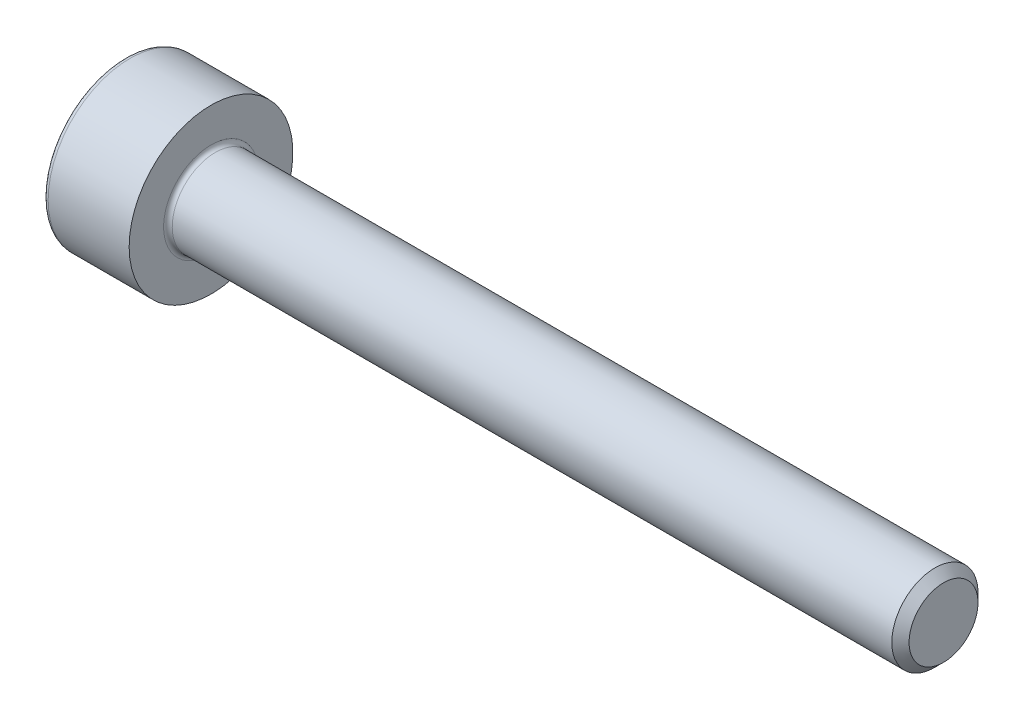
ISO-10303-21;
HEADER;
FILE_DESCRIPTION(('STEP AP214'),'2;1');
FILE_NAME('part.step','',(''),(''),'','','');
FILE_SCHEMA(('AUTOMOTIVE_DESIGN { 1 0 10303 214 1 1 1 1 }'));
ENDSEC;
DATA;
#1=APPLICATION_CONTEXT('core data for automotive mechanical design processes');
#2=APPLICATION_PROTOCOL_DEFINITION('international standard','automotive_design',2000,#1);
#3=PRODUCT_CONTEXT('',#1,'mechanical');
#4=PRODUCT('Part','Part','',(#3));
#5=PRODUCT_RELATED_PRODUCT_CATEGORY('part','',(#4));
#6=PRODUCT_DEFINITION_FORMATION('','',#4);
#7=PRODUCT_DEFINITION_CONTEXT('part definition',#1,'design');
#8=PRODUCT_DEFINITION('design','',#6,#7);
#9=PRODUCT_DEFINITION_SHAPE('','',#8);
#10=(LENGTH_UNIT() NAMED_UNIT(*) SI_UNIT(.MILLI.,.METRE.));
#11=(NAMED_UNIT(*) PLANE_ANGLE_UNIT() SI_UNIT($,.RADIAN.));
#12=(NAMED_UNIT(*) SI_UNIT($,.STERADIAN.) SOLID_ANGLE_UNIT());
#13=UNCERTAINTY_MEASURE_WITH_UNIT(LENGTH_MEASURE(1.E-05),#10,'distance_accuracy_value','');
#14=(GEOMETRIC_REPRESENTATION_CONTEXT(3) GLOBAL_UNCERTAINTY_ASSIGNED_CONTEXT((#13)) GLOBAL_UNIT_ASSIGNED_CONTEXT((#10,
#11,#12)) REPRESENTATION_CONTEXT('',''));
#15=CARTESIAN_POINT('',(0.,0.,0.));
#16=DIRECTION('',(0.,0.,1.));
#17=DIRECTION('',(1.,0.,0.));
#18=AXIS2_PLACEMENT_3D('',#15,#16,#17);
#19=CARTESIAN_POINT('',(19.0000000000048,0.,0.));
#20=DIRECTION('',(-1.,0.,0.));
#21=DIRECTION('',(0.,0.,1.));
#22=AXIS2_PLACEMENT_3D('',#19,#20,#21);
#23=PLANE('',#22);
#24=CARTESIAN_POINT('',(19.0000000000048,0.,0.));
#25=DIRECTION('',(-1.,0.,0.));
#26=DIRECTION('',(0.,0.,1.));
#27=AXIS2_PLACEMENT_3D('',#24,#25,#26);
#28=CIRCLE('',#27,0.800000000000004);
#29=CARTESIAN_POINT('',(19.0000000000048,0.,0.800000000000004));
#30=VERTEX_POINT('',#29);
#31=EDGE_CURVE('E11',#30,#30,#28,.F.);
#32=ORIENTED_EDGE('',*,*,#31,.T.);
#33=EDGE_LOOP('',(#32));
#34=FACE_BOUND('',#33,.T.);
#35=ADVANCED_FACE('F37',(#34),#23,.F.);
#36=CARTESIAN_POINT('',(0.,0.,0.));
#37=DIRECTION('',(-1.,0.,0.));
#38=DIRECTION('',(0.,0.,1.));
#39=AXIS2_PLACEMENT_3D('',#36,#37,#38);
#40=CYLINDRICAL_SURFACE('',#39,1.);
#41=CARTESIAN_POINT('',(18.8000000000048,0.,0.));
#42=DIRECTION('',(-1.,0.,0.));
#43=DIRECTION('',(0.,0.,1.));
#44=AXIS2_PLACEMENT_3D('',#41,#42,#43);
#45=CIRCLE('',#44,1.);
#46=CARTESIAN_POINT('',(18.8000000000048,0.,1.));
#47=VERTEX_POINT('',#46);
#48=EDGE_CURVE('E45',#47,#47,#45,.T.);
#49=ORIENTED_EDGE('',*,*,#48,.T.);
#50=EDGE_LOOP('',(#49));
#51=FACE_BOUND('',#50,.T.);
#52=CARTESIAN_POINT('',(2.10000000000477,0.,0.));
#53=DIRECTION('',(1.,0.,0.));
#54=DIRECTION('',(0.,0.,-1.));
#55=AXIS2_PLACEMENT_3D('',#52,#53,#54);
#56=CIRCLE('',#55,1.);
#57=CARTESIAN_POINT('',(2.10000000000477,0.,-1.));
#58=VERTEX_POINT('',#57);
#59=EDGE_CURVE('E150',#58,#58,#56,.T.);
#60=ORIENTED_EDGE('',*,*,#59,.T.);
#61=EDGE_LOOP('',(#60));
#62=FACE_BOUND('',#61,.T.);
#63=ADVANCED_FACE('F161',(#51,#62),#40,.T.);
#64=CARTESIAN_POINT('',(2.00000000000477,0.,0.));
#65=DIRECTION('',(1.,0.,0.));
#66=DIRECTION('',(0.,0.,-1.));
#67=AXIS2_PLACEMENT_3D('',#64,#65,#66);
#68=PLANE('',#67);
#69=CARTESIAN_POINT('',(2.00000000000477,0.,0.));
#70=DIRECTION('',(1.,0.,0.));
#71=DIRECTION('',(0.,0.,-1.));
#72=AXIS2_PLACEMENT_3D('',#69,#70,#71);
#73=CIRCLE('',#72,1.1);
#74=CARTESIAN_POINT('',(2.00000000000477,0.,-1.1));
#75=VERTEX_POINT('',#74);
#76=EDGE_CURVE('E147',#75,#75,#73,.F.);
#77=ORIENTED_EDGE('',*,*,#76,.T.);
#78=EDGE_LOOP('',(#77));
#79=FACE_BOUND('',#78,.T.);
#80=CARTESIAN_POINT('',(2.00000000000477,0.,0.));
#81=DIRECTION('',(-1.,0.,0.));
#82=DIRECTION('',(0.,0.,1.));
#83=AXIS2_PLACEMENT_3D('',#80,#81,#82);
#84=CIRCLE('',#83,1.9);
#85=CARTESIAN_POINT('',(2.00000000000477,0.,1.9));
#86=VERTEX_POINT('',#85);
#87=EDGE_CURVE('E139',#86,#86,#84,.T.);
#88=ORIENTED_EDGE('',*,*,#87,.F.);
#89=EDGE_LOOP('',(#88));
#90=FACE_BOUND('',#89,.T.);
#91=ADVANCED_FACE('F183',(#79,#90),#68,.T.);
#92=CARTESIAN_POINT('',(0.,0.,0.));
#93=DIRECTION('',(-1.,0.,0.));
#94=DIRECTION('',(0.,0.,1.));
#95=AXIS2_PLACEMENT_3D('',#92,#93,#94);
#96=CYLINDRICAL_SURFACE('',#95,1.9);
#97=CARTESIAN_POINT('',(0.12,0.,0.));
#98=DIRECTION('',(-1.,0.,0.));
#99=DIRECTION('',(0.,0.,1.));
#100=AXIS2_PLACEMENT_3D('',#97,#98,#99);
#101=CIRCLE('',#100,1.9);
#102=CARTESIAN_POINT('',(0.12,0.,1.9));
#103=VERTEX_POINT('',#102);
#104=EDGE_CURVE('E156',#103,#103,#101,.F.);
#105=ORIENTED_EDGE('',*,*,#104,.T.);
#106=EDGE_LOOP('',(#105));
#107=FACE_BOUND('',#106,.T.);
#108=ORIENTED_EDGE('',*,*,#87,.T.);
#109=EDGE_LOOP('',(#108));
#110=FACE_BOUND('',#109,.T.);
#111=ADVANCED_FACE('F193',(#107,#110),#96,.T.);
#112=CARTESIAN_POINT('',(0.,0.,0.));
#113=DIRECTION('',(-1.,0.,0.));
#114=DIRECTION('',(0.,0.,1.));
#115=AXIS2_PLACEMENT_3D('',#112,#113,#114);
#116=PLANE('',#115);
#117=DIRECTION('',(0.,0.5,-0.866025403784439));
#118=VECTOR('',#117,1.);
#119=CARTESIAN_POINT('',(0.,0.43301270189222,0.749999999999999));
#120=LINE('',#119,#118);
#121=CARTESIAN_POINT('',(0.,0.43301270189222,0.749999999999999));
#122=VERTEX_POINT('',#121);
#123=CARTESIAN_POINT('',(0.,0.866025403784438,0.));
#124=VERTEX_POINT('',#123);
#125=EDGE_CURVE('E52',#122,#124,#120,.T.);
#126=ORIENTED_EDGE('',*,*,#125,.F.);
#127=DIRECTION('',(0.,1.,0.));
#128=VECTOR('',#127,1.);
#129=CARTESIAN_POINT('',(0.,-0.43301270189222,0.749999999999999));
#130=LINE('',#129,#128);
#131=CARTESIAN_POINT('',(0.,-0.43301270189222,0.749999999999999));
#132=VERTEX_POINT('',#131);
#133=EDGE_CURVE('E135',#132,#122,#130,.T.);
#134=ORIENTED_EDGE('',*,*,#133,.F.);
#135=DIRECTION('',(0.,0.5,0.866025403784439));
#136=VECTOR('',#135,1.);
#137=CARTESIAN_POINT('',(0.,-0.866025403784438,0.));
#138=LINE('',#137,#136);
#139=CARTESIAN_POINT('',(0.,-0.866025403784438,0.));
#140=VERTEX_POINT('',#139);
#141=EDGE_CURVE('E133',#140,#132,#138,.T.);
#142=ORIENTED_EDGE('',*,*,#141,.F.);
#143=DIRECTION('',(0.,-0.5,0.866025403784439));
#144=VECTOR('',#143,1.);
#145=CARTESIAN_POINT('',(0.,-0.433012701892219,-0.75));
#146=LINE('',#145,#144);
#147=CARTESIAN_POINT('',(0.,-0.433012701892219,-0.75));
#148=VERTEX_POINT('',#147);
#149=EDGE_CURVE('E100',#148,#140,#146,.T.);
#150=ORIENTED_EDGE('',*,*,#149,.F.);
#151=DIRECTION('',(0.,-1.,0.));
#152=VECTOR('',#151,1.);
#153=CARTESIAN_POINT('',(0.,0.433012701892219,-0.75));
#154=LINE('',#153,#152);
#155=CARTESIAN_POINT('',(0.,0.433012701892219,-0.75));
#156=VERTEX_POINT('',#155);
#157=EDGE_CURVE('E129',#156,#148,#154,.T.);
#158=ORIENTED_EDGE('',*,*,#157,.F.);
#159=DIRECTION('',(0.,-0.5,-0.866025403784439));
#160=VECTOR('',#159,1.);
#161=CARTESIAN_POINT('',(0.,0.866025403784438,0.));
#162=LINE('',#161,#160);
#163=EDGE_CURVE('E126',#124,#156,#162,.T.);
#164=ORIENTED_EDGE('',*,*,#163,.F.);
#165=EDGE_LOOP('',(#126,#134,#142,#150,#158,#164));
#166=FACE_BOUND('',#165,.T.);
#167=CARTESIAN_POINT('',(0.,0.,0.));
#168=DIRECTION('',(-1.,0.,0.));
#169=DIRECTION('',(0.,0.,1.));
#170=AXIS2_PLACEMENT_3D('',#167,#168,#169);
#171=CIRCLE('',#170,1.78);
#172=CARTESIAN_POINT('',(0.,0.,1.78));
#173=VERTEX_POINT('',#172);
#174=EDGE_CURVE('E153',#173,#173,#171,.T.);
#175=ORIENTED_EDGE('',*,*,#174,.T.);
#176=EDGE_LOOP('',(#175));
#177=FACE_BOUND('',#176,.T.);
#178=ADVANCED_FACE('F188',(#166,#177),#116,.T.);
#179=CARTESIAN_POINT('',(2.10000000000477,0.,0.));
#180=DIRECTION('',(1.,0.,0.));
#181=DIRECTION('',(0.,0.,-1.));
#182=AXIS2_PLACEMENT_3D('',#179,#180,#181);
#183=TOROIDAL_SURFACE('',#182,1.1,0.1);
#184=ORIENTED_EDGE('',*,*,#59,.F.);
#185=EDGE_LOOP('',(#184));
#186=FACE_BOUND('',#185,.T.);
#187=ORIENTED_EDGE('',*,*,#76,.F.);
#188=EDGE_LOOP('',(#187));
#189=FACE_BOUND('',#188,.T.);
#190=ADVANCED_FACE('F174',(#186,#189),#183,.F.);
#191=CARTESIAN_POINT('',(0.12,0.,0.));
#192=DIRECTION('',(-1.,0.,0.));
#193=DIRECTION('',(0.,0.,1.));
#194=AXIS2_PLACEMENT_3D('',#191,#192,#193);
#195=TOROIDAL_SURFACE('',#194,1.78,0.12);
#196=ORIENTED_EDGE('',*,*,#104,.F.);
#197=EDGE_LOOP('',(#196));
#198=FACE_BOUND('',#197,.T.);
#199=ORIENTED_EDGE('',*,*,#174,.F.);
#200=EDGE_LOOP('',(#199));
#201=FACE_BOUND('',#200,.T.);
#202=ADVANCED_FACE('F166',(#198,#201),#195,.T.);
#203=CARTESIAN_POINT('',(18.8000000000048,0.,0.));
#204=DIRECTION('',(-1.,0.,0.));
#205=DIRECTION('',(0.,0.,1.));
#206=AXIS2_PLACEMENT_3D('',#203,#204,#205);
#207=CONICAL_SURFACE('',#206,1.,0.785398163397454);
#208=ORIENTED_EDGE('',*,*,#31,.F.);
#209=EDGE_LOOP('',(#208));
#210=FACE_BOUND('',#209,.T.);
#211=ORIENTED_EDGE('',*,*,#48,.F.);
#212=EDGE_LOOP('',(#211));
#213=FACE_BOUND('',#212,.T.);
#214=ADVANCED_FACE('F39',(#210,#213),#207,.T.);
#215=CARTESIAN_POINT('',(1.,0.43301270189222,0.749999999999999));
#216=DIRECTION('',(0.,0.866025403784439,0.5));
#217=DIRECTION('',(0.,-0.5,0.866025403784439));
#218=AXIS2_PLACEMENT_3D('',#215,#216,#217);
#219=PLANE('',#218);
#220=ORIENTED_EDGE('',*,*,#125,.T.);
#221=DIRECTION('',(-1.,0.,0.));
#222=VECTOR('',#221,1.);
#223=CARTESIAN_POINT('',(1.,0.866025403784438,0.));
#224=LINE('',#223,#222);
#225=CARTESIAN_POINT('',(1.,0.866025403784438,0.));
#226=VERTEX_POINT('',#225);
#227=EDGE_CURVE('E82',#226,#124,#224,.T.);
#228=ORIENTED_EDGE('',*,*,#227,.F.);
#229=DIRECTION('',(0.,0.5,-0.866025403784439));
#230=VECTOR('',#229,1.);
#231=CARTESIAN_POINT('',(1.,0.43301270189222,0.749999999999999));
#232=LINE('',#231,#230);
#233=CARTESIAN_POINT('',(1.,0.43301270189222,0.749999999999999));
#234=VERTEX_POINT('',#233);
#235=EDGE_CURVE('E137',#234,#226,#232,.T.);
#236=ORIENTED_EDGE('',*,*,#235,.F.);
#237=DIRECTION('',(-1.,0.,0.));
#238=VECTOR('',#237,1.);
#239=CARTESIAN_POINT('',(1.,0.43301270189222,0.749999999999999));
#240=LINE('',#239,#238);
#241=EDGE_CURVE('E60',#234,#122,#240,.T.);
#242=ORIENTED_EDGE('',*,*,#241,.T.);
#243=EDGE_LOOP('',(#220,#228,#236,#242));
#244=FACE_BOUND('',#243,.T.);
#245=ADVANCED_FACE('F165',(#244),#219,.F.);
#246=CARTESIAN_POINT('',(1.,-0.43301270189222,0.749999999999999));
#247=DIRECTION('',(0.,0.,1.));
#248=DIRECTION('',(0.,-1.,0.));
#249=AXIS2_PLACEMENT_3D('',#246,#247,#248);
#250=PLANE('',#249);
#251=ORIENTED_EDGE('',*,*,#133,.T.);
#252=ORIENTED_EDGE('',*,*,#241,.F.);
#253=DIRECTION('',(0.,1.,0.));
#254=VECTOR('',#253,1.);
#255=CARTESIAN_POINT('',(1.,-0.43301270189222,0.749999999999999));
#256=LINE('',#255,#254);
#257=CARTESIAN_POINT('',(1.,-0.43301270189222,0.749999999999999));
#258=VERTEX_POINT('',#257);
#259=EDGE_CURVE('E112',#258,#234,#256,.T.);
#260=ORIENTED_EDGE('',*,*,#259,.F.);
#261=DIRECTION('',(-1.,0.,0.));
#262=VECTOR('',#261,1.);
#263=CARTESIAN_POINT('',(1.,-0.43301270189222,0.749999999999999));
#264=LINE('',#263,#262);
#265=EDGE_CURVE('E104',#258,#132,#264,.T.);
#266=ORIENTED_EDGE('',*,*,#265,.T.);
#267=EDGE_LOOP('',(#251,#252,#260,#266));
#268=FACE_BOUND('',#267,.T.);
#269=ADVANCED_FACE('F172',(#268),#250,.F.);
#270=CARTESIAN_POINT('',(1.,-0.866025403784438,0.));
#271=DIRECTION('',(0.,-0.866025403784439,0.5));
#272=DIRECTION('',(0.,-0.5,-0.866025403784439));
#273=AXIS2_PLACEMENT_3D('',#270,#271,#272);
#274=PLANE('',#273);
#275=ORIENTED_EDGE('',*,*,#141,.T.);
#276=ORIENTED_EDGE('',*,*,#265,.F.);
#277=DIRECTION('',(0.,0.5,0.866025403784439));
#278=VECTOR('',#277,1.);
#279=CARTESIAN_POINT('',(1.,-0.866025403784438,0.));
#280=LINE('',#279,#278);
#281=CARTESIAN_POINT('',(1.,-0.866025403784438,0.));
#282=VERTEX_POINT('',#281);
#283=EDGE_CURVE('E108',#282,#258,#280,.T.);
#284=ORIENTED_EDGE('',*,*,#283,.F.);
#285=DIRECTION('',(-1.,0.,0.));
#286=VECTOR('',#285,1.);
#287=CARTESIAN_POINT('',(1.,-0.866025403784438,0.));
#288=LINE('',#287,#286);
#289=EDGE_CURVE('E93',#282,#140,#288,.T.);
#290=ORIENTED_EDGE('',*,*,#289,.T.);
#291=EDGE_LOOP('',(#275,#276,#284,#290));
#292=FACE_BOUND('',#291,.T.);
#293=ADVANCED_FACE('F109',(#292),#274,.F.);
#294=CARTESIAN_POINT('',(1.,-0.433012701892219,-0.75));
#295=DIRECTION('',(0.,-0.866025403784439,-0.5));
#296=DIRECTION('',(0.,0.5,-0.866025403784439));
#297=AXIS2_PLACEMENT_3D('',#294,#295,#296);
#298=PLANE('',#297);
#299=ORIENTED_EDGE('',*,*,#149,.T.);
#300=ORIENTED_EDGE('',*,*,#289,.F.);
#301=DIRECTION('',(0.,-0.5,0.866025403784439));
#302=VECTOR('',#301,1.);
#303=CARTESIAN_POINT('',(1.,-0.433012701892219,-0.75));
#304=LINE('',#303,#302);
#305=CARTESIAN_POINT('',(1.,-0.433012701892219,-0.75));
#306=VERTEX_POINT('',#305);
#307=EDGE_CURVE('E97',#306,#282,#304,.T.);
#308=ORIENTED_EDGE('',*,*,#307,.F.);
#309=DIRECTION('',(-1.,0.,0.));
#310=VECTOR('',#309,1.);
#311=CARTESIAN_POINT('',(1.,-0.433012701892219,-0.75));
#312=LINE('',#311,#310);
#313=EDGE_CURVE('E105',#306,#148,#312,.T.);
#314=ORIENTED_EDGE('',*,*,#313,.T.);
#315=EDGE_LOOP('',(#299,#300,#308,#314));
#316=FACE_BOUND('',#315,.T.);
#317=ADVANCED_FACE('F95',(#316),#298,.F.);
#318=CARTESIAN_POINT('',(1.,0.433012701892219,-0.75));
#319=DIRECTION('',(0.,0.,-1.));
#320=DIRECTION('',(0.,1.,0.));
#321=AXIS2_PLACEMENT_3D('',#318,#319,#320);
#322=PLANE('',#321);
#323=ORIENTED_EDGE('',*,*,#157,.T.);
#324=ORIENTED_EDGE('',*,*,#313,.F.);
#325=DIRECTION('',(0.,-1.,0.));
#326=VECTOR('',#325,1.);
#327=CARTESIAN_POINT('',(1.,0.433012701892219,-0.75));
#328=LINE('',#327,#326);
#329=CARTESIAN_POINT('',(1.,0.433012701892219,-0.75));
#330=VERTEX_POINT('',#329);
#331=EDGE_CURVE('E118',#330,#306,#328,.T.);
#332=ORIENTED_EDGE('',*,*,#331,.F.);
#333=DIRECTION('',(-1.,0.,0.));
#334=VECTOR('',#333,1.);
#335=CARTESIAN_POINT('',(1.,0.433012701892219,-0.75));
#336=LINE('',#335,#334);
#337=EDGE_CURVE('E142',#330,#156,#336,.T.);
#338=ORIENTED_EDGE('',*,*,#337,.T.);
#339=EDGE_LOOP('',(#323,#324,#332,#338));
#340=FACE_BOUND('',#339,.T.);
#341=ADVANCED_FACE('F213',(#340),#322,.F.);
#342=CARTESIAN_POINT('',(1.,0.866025403784438,0.));
#343=DIRECTION('',(0.,0.866025403784439,-0.5));
#344=DIRECTION('',(0.,0.5,0.866025403784439));
#345=AXIS2_PLACEMENT_3D('',#342,#343,#344);
#346=PLANE('',#345);
#347=ORIENTED_EDGE('',*,*,#163,.T.);
#348=ORIENTED_EDGE('',*,*,#337,.F.);
#349=DIRECTION('',(0.,-0.5,-0.866025403784439));
#350=VECTOR('',#349,1.);
#351=CARTESIAN_POINT('',(1.,0.866025403784438,0.));
#352=LINE('',#351,#350);
#353=EDGE_CURVE('E120',#226,#330,#352,.T.);
#354=ORIENTED_EDGE('',*,*,#353,.F.);
#355=ORIENTED_EDGE('',*,*,#227,.T.);
#356=EDGE_LOOP('',(#347,#348,#354,#355));
#357=FACE_BOUND('',#356,.T.);
#358=ADVANCED_FACE('F210',(#357),#346,.F.);
#359=CARTESIAN_POINT('',(1.,0.,0.));
#360=DIRECTION('',(-1.,0.,0.));
#361=DIRECTION('',(0.,0.,1.));
#362=AXIS2_PLACEMENT_3D('',#359,#360,#361);
#363=PLANE('',#362);
#364=ORIENTED_EDGE('',*,*,#235,.T.);
#365=ORIENTED_EDGE('',*,*,#353,.T.);
#366=ORIENTED_EDGE('',*,*,#331,.T.);
#367=ORIENTED_EDGE('',*,*,#307,.T.);
#368=ORIENTED_EDGE('',*,*,#283,.T.);
#369=ORIENTED_EDGE('',*,*,#259,.T.);
#370=EDGE_LOOP('',(#364,#365,#366,#367,#368,#369));
#371=FACE_BOUND('',#370,.T.);
#372=ADVANCED_FACE('F115',(#371),#363,.T.);
#373=CLOSED_SHELL('',(#35,#63,#91,#111,#178,#190,#202,#214,#245,#269,#293,#317,#341,#358,#372));
#374=MANIFOLD_SOLID_BREP('B2',#373);
#375=ADVANCED_BREP_SHAPE_REPRESENTATION('',(#18,#374),#14);
#376=SHAPE_DEFINITION_REPRESENTATION(#9,#375);
ENDSEC;
END-ISO-10303-21;
